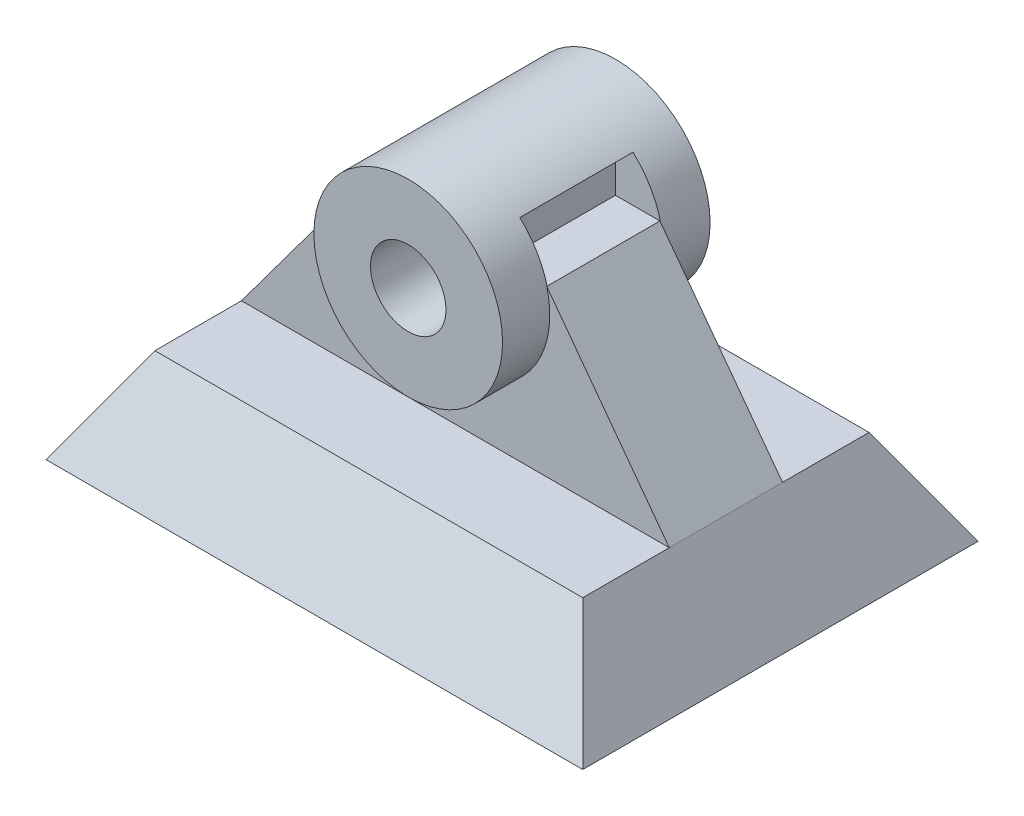
ISO-10303-21;
HEADER;
FILE_DESCRIPTION(('STEP AP214'),'2;1');
FILE_NAME('part.step','',(''),(''),'','','');
FILE_SCHEMA(('AUTOMOTIVE_DESIGN { 1 0 10303 214 1 1 1 1 }'));
ENDSEC;
DATA;
#1=APPLICATION_CONTEXT('core data for automotive mechanical design processes');
#2=APPLICATION_PROTOCOL_DEFINITION('international standard','automotive_design',2000,#1);
#3=PRODUCT_CONTEXT('',#1,'mechanical');
#4=PRODUCT('Part','Part','',(#3));
#5=PRODUCT_RELATED_PRODUCT_CATEGORY('part','',(#4));
#6=PRODUCT_DEFINITION_FORMATION('','',#4);
#7=PRODUCT_DEFINITION_CONTEXT('part definition',#1,'design');
#8=PRODUCT_DEFINITION('design','',#6,#7);
#9=PRODUCT_DEFINITION_SHAPE('','',#8);
#10=(LENGTH_UNIT() NAMED_UNIT(*) SI_UNIT(.MILLI.,.METRE.));
#11=(NAMED_UNIT(*) PLANE_ANGLE_UNIT() SI_UNIT($,.RADIAN.));
#12=(NAMED_UNIT(*) SI_UNIT($,.STERADIAN.) SOLID_ANGLE_UNIT());
#13=UNCERTAINTY_MEASURE_WITH_UNIT(LENGTH_MEASURE(1.E-05),#10,'distance_accuracy_value','');
#14=(GEOMETRIC_REPRESENTATION_CONTEXT(3) GLOBAL_UNCERTAINTY_ASSIGNED_CONTEXT((#13)) GLOBAL_UNIT_ASSIGNED_CONTEXT((#10,
#11,#12)) REPRESENTATION_CONTEXT('',''));
#15=CARTESIAN_POINT('',(0.,0.,0.));
#16=DIRECTION('',(0.,0.,1.));
#17=DIRECTION('',(1.,0.,0.));
#18=AXIS2_PLACEMENT_3D('',#15,#16,#17);
#19=CARTESIAN_POINT('',(-21.295609800344,55.,-18.));
#20=DIRECTION('',(0.,-1.,0.));
#21=DIRECTION('',(0.,0.,-1.));
#22=AXIS2_PLACEMENT_3D('',#19,#20,#21);
#23=PLANE('',#22);
#24=DIRECTION('',(0.,0.,-1.));
#25=VECTOR('',#24,1.);
#26=CARTESIAN_POINT('',(8.,55.,-42.));
#27=LINE('',#26,#25);
#28=CARTESIAN_POINT('',(8.,55.,-18.0806278170545));
#29=VERTEX_POINT('',#28);
#30=CARTESIAN_POINT('',(8.,55.,-42.));
#31=VERTEX_POINT('',#30);
#32=EDGE_CURVE('E320',#29,#31,#27,.T.);
#33=ORIENTED_EDGE('',*,*,#32,.F.);
#34=DIRECTION('',(-1.,0.,0.));
#35=VECTOR('',#34,1.);
#36=CARTESIAN_POINT('',(-21.295609800344,55.,-18.0806278170545));
#37=LINE('',#36,#35);
#38=CARTESIAN_POINT('',(17.4342236617302,55.,-18.0806278170545));
#39=VERTEX_POINT('',#38);
#40=EDGE_CURVE('E45',#39,#29,#37,.T.);
#41=ORIENTED_EDGE('',*,*,#40,.F.);
#42=DIRECTION('',(0.,0.,-1.));
#43=VECTOR('',#42,1.);
#44=CARTESIAN_POINT('',(17.4342236617302,55.,-18.));
#45=LINE('',#44,#43);
#46=CARTESIAN_POINT('',(17.4342236617302,55.,-42.));
#47=VERTEX_POINT('',#46);
#48=EDGE_CURVE('E255',#39,#47,#45,.T.);
#49=ORIENTED_EDGE('',*,*,#48,.T.);
#50=DIRECTION('',(-1.,0.,0.));
#51=VECTOR('',#50,1.);
#52=CARTESIAN_POINT('',(-21.295609800344,55.,-42.));
#53=LINE('',#52,#51);
#54=EDGE_CURVE('E237',#47,#31,#53,.T.);
#55=ORIENTED_EDGE('',*,*,#54,.T.);
#56=EDGE_LOOP('',(#33,#41,#49,#55));
#57=FACE_BOUND('',#56,.T.);
#58=ADVANCED_FACE('F37',(#57),#23,.F.);
#59=CARTESIAN_POINT('',(-22.,38.5972880011593,-18.0806278170545));
#60=DIRECTION('',(0.,0.,1.));
#61=DIRECTION('',(1.,0.,0.));
#62=AXIS2_PLACEMENT_3D('',#59,#60,#61);
#63=PLANE('',#62);
#64=DIRECTION('',(0.,-1.,0.));
#65=VECTOR('',#64,1.);
#66=CARTESIAN_POINT('',(8.,55.,-18.0806278170545));
#67=LINE('',#66,#65);
#68=CARTESIAN_POINT('',(8.,64.691048725986,-18.0806278170545));
#69=VERTEX_POINT('',#68);
#70=EDGE_CURVE('E181',#69,#29,#67,.T.);
#71=ORIENTED_EDGE('',*,*,#70,.F.);
#72=DIRECTION('',(1.,0.,0.));
#73=VECTOR('',#72,1.);
#74=CARTESIAN_POINT('',(-22.,64.691048725986,-18.0806278170545));
#75=LINE('',#74,#73);
#76=CARTESIAN_POINT('',(11.6403454808817,64.691048725986,-18.0806278170545));
#77=VERTEX_POINT('',#76);
#78=EDGE_CURVE('E192',#69,#77,#75,.T.);
#79=ORIENTED_EDGE('',*,*,#78,.T.);
#80=CARTESIAN_POINT('',(-1.93069306930694,50.,-18.0806278170545));
#81=DIRECTION('',(0.,0.,1.));
#82=DIRECTION('',(1.,0.,0.));
#83=AXIS2_PLACEMENT_3D('',#80,#81,#82);
#84=CIRCLE('',#83,20.);
#85=EDGE_CURVE('E188',#39,#77,#84,.T.);
#86=ORIENTED_EDGE('',*,*,#85,.F.);
#87=ORIENTED_EDGE('',*,*,#40,.T.);
#88=EDGE_LOOP('',(#71,#79,#86,#87));
#89=FACE_BOUND('',#88,.T.);
#90=ADVANCED_FACE('F313',(#89),#63,.F.);
#91=CARTESIAN_POINT('',(-22.,64.691048725986,-18.0806278170545));
#92=DIRECTION('',(0.,1.,0.));
#93=DIRECTION('',(0.,0.,1.));
#94=AXIS2_PLACEMENT_3D('',#91,#92,#93);
#95=PLANE('',#94);
#96=DIRECTION('',(0.,0.,1.));
#97=VECTOR('',#96,1.);
#98=CARTESIAN_POINT('',(8.,64.691048725986,-18.0806278170545));
#99=LINE('',#98,#97);
#100=CARTESIAN_POINT('',(8.,64.691048725986,-42.0806278170545));
#101=VERTEX_POINT('',#100);
#102=EDGE_CURVE('E322',#101,#69,#99,.T.);
#103=ORIENTED_EDGE('',*,*,#102,.F.);
#104=DIRECTION('',(1.,0.,0.));
#105=VECTOR('',#104,1.);
#106=CARTESIAN_POINT('',(-22.,64.691048725986,-42.0806278170545));
#107=LINE('',#106,#105);
#108=CARTESIAN_POINT('',(11.6403454808817,64.691048725986,-42.0806278170545));
#109=VERTEX_POINT('',#108);
#110=EDGE_CURVE('E171',#101,#109,#107,.T.);
#111=ORIENTED_EDGE('',*,*,#110,.T.);
#112=DIRECTION('',(0.,0.,-1.));
#113=VECTOR('',#112,1.);
#114=CARTESIAN_POINT('',(11.6403454808817,64.691048725986,-8.));
#115=LINE('',#114,#113);
#116=EDGE_CURVE('E223',#77,#109,#115,.T.);
#117=ORIENTED_EDGE('',*,*,#116,.F.);
#118=ORIENTED_EDGE('',*,*,#78,.F.);
#119=EDGE_LOOP('',(#103,#111,#117,#118));
#120=FACE_BOUND('',#119,.T.);
#121=ADVANCED_FACE('F373',(#120),#95,.F.);
#122=CARTESIAN_POINT('',(-12.,55.,-18.0806278170545));
#123=VERTEX_POINT('',#122);
#124=CARTESIAN_POINT('',(-21.295609800344,55.,-18.0806278170545));
#125=VERTEX_POINT('',#124);
#126=EDGE_CURVE('E305',#123,#125,#37,.T.);
#127=ORIENTED_EDGE('',*,*,#126,.F.);
#128=DIRECTION('',(0.,0.,-1.));
#129=VECTOR('',#128,1.);
#130=CARTESIAN_POINT('',(-12.,55.,-42.));
#131=LINE('',#130,#129);
#132=CARTESIAN_POINT('',(-12.,55.,-42.));
#133=VERTEX_POINT('',#132);
#134=EDGE_CURVE('E52',#123,#133,#131,.T.);
#135=ORIENTED_EDGE('',*,*,#134,.T.);
#136=CARTESIAN_POINT('',(-21.295609800344,55.,-42.));
#137=VERTEX_POINT('',#136);
#138=EDGE_CURVE('E250',#133,#137,#53,.T.);
#139=ORIENTED_EDGE('',*,*,#138,.T.);
#140=DIRECTION('',(0.,0.,-1.));
#141=VECTOR('',#140,1.);
#142=CARTESIAN_POINT('',(-21.295609800344,55.,-18.));
#143=LINE('',#142,#141);
#144=EDGE_CURVE('E242',#125,#137,#143,.T.);
#145=ORIENTED_EDGE('',*,*,#144,.F.);
#146=EDGE_LOOP('',(#127,#135,#139,#145));
#147=FACE_BOUND('',#146,.T.);
#148=ADVANCED_FACE('F365',(#147),#23,.F.);
#149=CARTESIAN_POINT('',(0.,0.,-18.));
#150=DIRECTION('',(0.,0.,-1.));
#151=DIRECTION('',(-1.,0.,0.));
#152=AXIS2_PLACEMENT_3D('',#149,#150,#151);
#153=PLANE('',#152);
#154=CARTESIAN_POINT('',(-1.93069306930694,50.,-18.));
#155=DIRECTION('',(0.,0.,-1.));
#156=DIRECTION('',(-1.,0.,0.));
#157=AXIS2_PLACEMENT_3D('',#154,#155,#156);
#158=CIRCLE('',#157,20.);
#159=CARTESIAN_POINT('',(-21.295609800344,55.,-18.));
#160=VERTEX_POINT('',#159);
#161=CARTESIAN_POINT('',(17.4342236617302,55.,-18.));
#162=VERTEX_POINT('',#161);
#163=EDGE_CURVE('E229',#160,#162,#158,.F.);
#164=ORIENTED_EDGE('',*,*,#163,.F.);
#165=DIRECTION('',(-0.596090179592801,-0.802917491273557,0.));
#166=VECTOR('',#165,1.);
#167=CARTESIAN_POINT('',(-47.2797943678713,20.,-18.));
#168=LINE('',#167,#166);
#169=CARTESIAN_POINT('',(-47.2797943678713,20.,-18.));
#170=VERTEX_POINT('',#169);
#171=EDGE_CURVE('E233',#160,#170,#168,.T.);
#172=ORIENTED_EDGE('',*,*,#171,.T.);
#173=DIRECTION('',(1.,0.,0.));
#174=VECTOR('',#173,1.);
#175=CARTESIAN_POINT('',(43.4184082292574,20.,-18.));
#176=LINE('',#175,#174);
#177=CARTESIAN_POINT('',(43.4184082292574,20.,-18.));
#178=VERTEX_POINT('',#177);
#179=EDGE_CURVE('E236',#170,#178,#176,.T.);
#180=ORIENTED_EDGE('',*,*,#179,.T.);
#181=DIRECTION('',(-0.596090179592801,0.802917491273557,0.));
#182=VECTOR('',#181,1.);
#183=CARTESIAN_POINT('',(17.4342236617302,55.,-18.));
#184=LINE('',#183,#182);
#185=EDGE_CURVE('E240',#178,#162,#184,.T.);
#186=ORIENTED_EDGE('',*,*,#185,.T.);
#187=EDGE_LOOP('',(#164,#172,#180,#186));
#188=FACE_BOUND('',#187,.T.);
#189=ADVANCED_FACE('F355',(#188),#153,.F.);
#190=CARTESIAN_POINT('',(0.,0.,-42.));
#191=DIRECTION('',(0.,0.,-1.));
#192=DIRECTION('',(-1.,0.,0.));
#193=AXIS2_PLACEMENT_3D('',#190,#191,#192);
#194=PLANE('',#193);
#195=CARTESIAN_POINT('',(-1.93069306930694,50.,-42.));
#196=DIRECTION('',(0.,0.,-1.));
#197=DIRECTION('',(-1.,0.,0.));
#198=AXIS2_PLACEMENT_3D('',#195,#196,#197);
#199=CIRCLE('',#198,8.);
#200=CARTESIAN_POINT('',(4.31430492909144,55.,-42.));
#201=VERTEX_POINT('',#200);
#202=CARTESIAN_POINT('',(-8.17569106770532,55.,-42.));
#203=VERTEX_POINT('',#202);
#204=EDGE_CURVE('E164',#201,#203,#199,.T.);
#205=ORIENTED_EDGE('',*,*,#204,.F.);
#206=DIRECTION('',(-1.,0.,0.));
#207=VECTOR('',#206,1.);
#208=CARTESIAN_POINT('',(8.,55.,-42.));
#209=LINE('',#208,#207);
#210=EDGE_CURVE('E60',#31,#201,#209,.T.);
#211=ORIENTED_EDGE('',*,*,#210,.F.);
#212=ORIENTED_EDGE('',*,*,#54,.F.);
#213=DIRECTION('',(-0.596090179592801,0.802917491273557,0.));
#214=VECTOR('',#213,1.);
#215=CARTESIAN_POINT('',(17.4342236617302,55.,-42.));
#216=LINE('',#215,#214);
#217=CARTESIAN_POINT('',(43.4184082292574,20.,-42.));
#218=VERTEX_POINT('',#217);
#219=EDGE_CURVE('E247',#218,#47,#216,.T.);
#220=ORIENTED_EDGE('',*,*,#219,.F.);
#221=DIRECTION('',(1.,0.,0.));
#222=VECTOR('',#221,1.);
#223=CARTESIAN_POINT('',(43.4184082292574,20.,-42.));
#224=LINE('',#223,#222);
#225=CARTESIAN_POINT('',(-47.2797943678713,20.,-42.));
#226=VERTEX_POINT('',#225);
#227=EDGE_CURVE('E245',#226,#218,#224,.T.);
#228=ORIENTED_EDGE('',*,*,#227,.F.);
#229=DIRECTION('',(-0.596090179592801,-0.802917491273557,0.));
#230=VECTOR('',#229,1.);
#231=CARTESIAN_POINT('',(-47.2797943678713,20.,-42.));
#232=LINE('',#231,#230);
#233=EDGE_CURVE('E232',#137,#226,#232,.T.);
#234=ORIENTED_EDGE('',*,*,#233,.F.);
#235=ORIENTED_EDGE('',*,*,#138,.F.);
#236=EDGE_CURVE('E170',#203,#133,#53,.T.);
#237=ORIENTED_EDGE('',*,*,#236,.F.);
#238=EDGE_LOOP('',(#205,#211,#212,#220,#228,#234,#235,#237));
#239=FACE_BOUND('',#238,.T.);
#240=DIRECTION('',(-1.,0.,0.));
#241=VECTOR('',#240,1.);
#242=CARTESIAN_POINT('',(0.,38.5972880011593,-42.));
#243=LINE('',#242,#241);
#244=CARTESIAN_POINT('',(14.5003190441173,38.5972880011592,-42.));
#245=VERTEX_POINT('',#244);
#246=CARTESIAN_POINT('',(-18.3617051827312,38.5972880011593,-42.));
#247=VERTEX_POINT('',#246);
#248=EDGE_CURVE('E300',#245,#247,#243,.T.);
#249=ORIENTED_EDGE('',*,*,#248,.T.);
#250=CARTESIAN_POINT('',(-1.93069306930694,50.,-42.));
#251=DIRECTION('',(0.,0.,-1.));
#252=DIRECTION('',(-1.,0.,0.));
#253=AXIS2_PLACEMENT_3D('',#250,#251,#252);
#254=CIRCLE('',#253,20.);
#255=EDGE_CURVE('E303',#247,#245,#254,.F.);
#256=ORIENTED_EDGE('',*,*,#255,.T.);
#257=EDGE_LOOP('',(#249,#256));
#258=FACE_BOUND('',#257,.T.);
#259=ADVANCED_FACE('F168',(#239,#258),#194,.T.);
#260=CARTESIAN_POINT('',(-46.9306930693069,20.,-60.));
#261=DIRECTION('',(0.,1.,0.));
#262=DIRECTION('',(0.,0.,1.));
#263=AXIS2_PLACEMENT_3D('',#260,#261,#262);
#264=PLANE('',#263);
#265=DIRECTION('',(0.,0.,1.));
#266=VECTOR('',#265,1.);
#267=CARTESIAN_POINT('',(-47.2797943678713,20.,-60.));
#268=LINE('',#267,#266);
#269=CARTESIAN_POINT('',(-47.2797943678713,20.,-60.3491012985643));
#270=VERTEX_POINT('',#269);
#271=EDGE_CURVE('E265',#270,#226,#268,.T.);
#272=ORIENTED_EDGE('',*,*,#271,.T.);
#273=ORIENTED_EDGE('',*,*,#227,.T.);
#274=DIRECTION('',(0.,0.,1.));
#275=VECTOR('',#274,1.);
#276=CARTESIAN_POINT('',(43.4184082292574,20.,-60.));
#277=LINE('',#276,#275);
#278=CARTESIAN_POINT('',(43.4184082292574,20.,-60.3491012985643));
#279=VERTEX_POINT('',#278);
#280=EDGE_CURVE('E275',#279,#218,#277,.T.);
#281=ORIENTED_EDGE('',*,*,#280,.F.);
#282=DIRECTION('',(-1.,0.,0.));
#283=VECTOR('',#282,1.);
#284=CARTESIAN_POINT('',(-46.9306930693069,20.,-60.3491012985643));
#285=LINE('',#284,#283);
#286=EDGE_CURVE('E279',#279,#270,#285,.T.);
#287=ORIENTED_EDGE('',*,*,#286,.T.);
#288=EDGE_LOOP('',(#272,#273,#281,#287));
#289=FACE_BOUND('',#288,.T.);
#290=ADVANCED_FACE('F354',(#289),#264,.T.);
#291=CARTESIAN_POINT('',(43.0693069306931,0.,-60.));
#292=DIRECTION('',(0.,-1.,0.));
#293=DIRECTION('',(0.,0.,-1.));
#294=AXIS2_PLACEMENT_3D('',#291,#292,#293);
#295=PLANE('',#294);
#296=DIRECTION('',(-1.,0.,0.));
#297=VECTOR('',#296,1.);
#298=CARTESIAN_POINT('',(43.0693069306931,0.,11.8961066823569));
#299=LINE('',#298,#297);
#300=CARTESIAN_POINT('',(-58.8267997516638,0.,11.8961066823569));
#301=VERTEX_POINT('',#300);
#302=CARTESIAN_POINT('',(54.96541361305,0.,11.8961066823569));
#303=VERTEX_POINT('',#302);
#304=EDGE_CURVE('E264',#301,#303,#299,.F.);
#305=ORIENTED_EDGE('',*,*,#304,.F.);
#306=DIRECTION('',(0.,0.,1.));
#307=VECTOR('',#306,1.);
#308=CARTESIAN_POINT('',(-58.8267997516638,0.,-60.));
#309=LINE('',#308,#307);
#310=CARTESIAN_POINT('',(-58.8267997516638,0.,-71.8961066823569));
#311=VERTEX_POINT('',#310);
#312=EDGE_CURVE('E268',#311,#301,#309,.T.);
#313=ORIENTED_EDGE('',*,*,#312,.F.);
#314=DIRECTION('',(1.,0.,0.));
#315=VECTOR('',#314,1.);
#316=CARTESIAN_POINT('',(43.0693069306931,0.,-71.8961066823569));
#317=LINE('',#316,#315);
#318=CARTESIAN_POINT('',(54.96541361305,0.,-71.8961066823569));
#319=VERTEX_POINT('',#318);
#320=EDGE_CURVE('E289',#311,#319,#317,.T.);
#321=ORIENTED_EDGE('',*,*,#320,.T.);
#322=DIRECTION('',(0.,0.,1.));
#323=VECTOR('',#322,1.);
#324=CARTESIAN_POINT('',(54.96541361305,0.,-60.));
#325=LINE('',#324,#323);
#326=EDGE_CURVE('E286',#319,#303,#325,.T.);
#327=ORIENTED_EDGE('',*,*,#326,.T.);
#328=EDGE_LOOP('',(#305,#313,#321,#327));
#329=FACE_BOUND('',#328,.T.);
#330=ADVANCED_FACE('F361',(#329),#295,.T.);
#331=CARTESIAN_POINT('',(-47.2797943678713,20.,-60.));
#332=DIRECTION('',(-0.866025403784438,0.500000000000001,0.));
#333=DIRECTION('',(-0.500000000000001,-0.866025403784438,0.));
#334=AXIS2_PLACEMENT_3D('',#331,#332,#333);
#335=PLANE('',#334);
#336=DIRECTION('',(0.447213595499959,0.774596669241482,-0.447213595499959));
#337=VECTOR('',#336,1.);
#338=CARTESIAN_POINT('',(-35.2099741081584,40.9055419280469,-11.7207189611486));
#339=LINE('',#338,#337);
#340=CARTESIAN_POINT('',(-47.2797943678713,20.,0.349101298564352));
#341=VERTEX_POINT('',#340);
#342=EDGE_CURVE('E273',#341,#301,#339,.F.);
#343=ORIENTED_EDGE('',*,*,#342,.F.);
#344=EDGE_CURVE('E269',#170,#341,#268,.T.);
#345=ORIENTED_EDGE('',*,*,#344,.F.);
#346=DIRECTION('',(0.,0.,-1.));
#347=VECTOR('',#346,1.);
#348=CARTESIAN_POINT('',(-47.2797943678713,20.,-18.));
#349=LINE('',#348,#347);
#350=EDGE_CURVE('E262',#170,#226,#349,.T.);
#351=ORIENTED_EDGE('',*,*,#350,.T.);
#352=ORIENTED_EDGE('',*,*,#271,.F.);
#353=DIRECTION('',(-0.447213595499959,-0.774596669241482,-0.447213595499959));
#354=VECTOR('',#353,1.);
#355=CARTESIAN_POINT('',(-47.2099741081584,20.1209322372203,-60.2792810388515));
#356=LINE('',#355,#354);
#357=EDGE_CURVE('E282',#270,#311,#356,.T.);
#358=ORIENTED_EDGE('',*,*,#357,.T.);
#359=ORIENTED_EDGE('',*,*,#312,.T.);
#360=EDGE_LOOP('',(#343,#345,#351,#352,#358,#359));
#361=FACE_BOUND('',#360,.T.);
#362=ADVANCED_FACE('F528',(#361),#335,.T.);
#363=ORIENTED_EDGE('',*,*,#179,.F.);
#364=ORIENTED_EDGE('',*,*,#344,.T.);
#365=DIRECTION('',(1.,0.,0.));
#366=VECTOR('',#365,1.);
#367=CARTESIAN_POINT('',(-46.9306930693069,20.,0.349101298564351));
#368=LINE('',#367,#366);
#369=CARTESIAN_POINT('',(43.4184082292574,20.,0.349101298564352));
#370=VERTEX_POINT('',#369);
#371=EDGE_CURVE('E270',#370,#341,#368,.F.);
#372=ORIENTED_EDGE('',*,*,#371,.F.);
#373=EDGE_CURVE('E278',#178,#370,#277,.T.);
#374=ORIENTED_EDGE('',*,*,#373,.F.);
#375=EDGE_LOOP('',(#363,#364,#372,#374));
#376=FACE_BOUND('',#375,.T.);
#377=ADVANCED_FACE('F364',(#376),#264,.T.);
#378=CARTESIAN_POINT('',(43.4184082292574,20.,-60.));
#379=DIRECTION('',(0.866025403784438,0.500000000000001,0.));
#380=DIRECTION('',(-0.500000000000001,0.866025403784438,0.));
#381=AXIS2_PLACEMENT_3D('',#378,#379,#380);
#382=PLANE('',#381);
#383=DIRECTION('',(0.447213595499959,-0.774596669241482,0.447213595499959));
#384=VECTOR('',#383,1.);
#385=CARTESIAN_POINT('',(31.3485879695445,40.9055419280469,-11.7207189611486));
#386=LINE('',#385,#384);
#387=EDGE_CURVE('E274',#303,#370,#386,.F.);
#388=ORIENTED_EDGE('',*,*,#387,.F.);
#389=ORIENTED_EDGE('',*,*,#326,.F.);
#390=DIRECTION('',(-0.447213595499959,0.774596669241482,0.447213595499959));
#391=VECTOR('',#390,1.);
#392=CARTESIAN_POINT('',(43.3485879695445,20.1209322372203,-60.2792810388515));
#393=LINE('',#392,#391);
#394=EDGE_CURVE('E283',#319,#279,#393,.T.);
#395=ORIENTED_EDGE('',*,*,#394,.T.);
#396=ORIENTED_EDGE('',*,*,#280,.T.);
#397=DIRECTION('',(0.,0.,-1.));
#398=VECTOR('',#397,1.);
#399=CARTESIAN_POINT('',(43.4184082292574,20.,-18.));
#400=LINE('',#399,#398);
#401=EDGE_CURVE('E259',#178,#218,#400,.T.);
#402=ORIENTED_EDGE('',*,*,#401,.F.);
#403=ORIENTED_EDGE('',*,*,#373,.T.);
#404=EDGE_LOOP('',(#388,#389,#395,#396,#402,#403));
#405=FACE_BOUND('',#404,.T.);
#406=ADVANCED_FACE('F513',(#405),#382,.T.);
#407=CARTESIAN_POINT('',(-46.9306930693069,20.,-60.3491012985643));
#408=DIRECTION('',(0.,0.500000000000001,-0.866025403784438));
#409=DIRECTION('',(0.,0.866025403784438,0.500000000000001));
#410=AXIS2_PLACEMENT_3D('',#407,#408,#409);
#411=PLANE('',#410);
#412=ORIENTED_EDGE('',*,*,#320,.F.);
#413=ORIENTED_EDGE('',*,*,#357,.F.);
#414=ORIENTED_EDGE('',*,*,#286,.F.);
#415=ORIENTED_EDGE('',*,*,#394,.F.);
#416=EDGE_LOOP('',(#412,#413,#414,#415));
#417=FACE_BOUND('',#416,.T.);
#418=ADVANCED_FACE('F505',(#417),#411,.T.);
#419=CARTESIAN_POINT('',(-46.9306930693069,20.,0.349101298564351));
#420=DIRECTION('',(0.,0.500000000000001,0.866025403784438));
#421=DIRECTION('',(0.,-0.866025403784438,0.500000000000001));
#422=AXIS2_PLACEMENT_3D('',#419,#420,#421);
#423=PLANE('',#422);
#424=ORIENTED_EDGE('',*,*,#304,.T.);
#425=ORIENTED_EDGE('',*,*,#387,.T.);
#426=ORIENTED_EDGE('',*,*,#371,.T.);
#427=ORIENTED_EDGE('',*,*,#342,.T.);
#428=EDGE_LOOP('',(#424,#425,#426,#427));
#429=FACE_BOUND('',#428,.T.);
#430=ADVANCED_FACE('F39',(#429),#423,.T.);
#431=CARTESIAN_POINT('',(-47.2797943678713,20.,-18.));
#432=DIRECTION('',(0.802917491273557,-0.596090179592801,0.));
#433=DIRECTION('',(0.596090179592801,0.802917491273557,0.));
#434=AXIS2_PLACEMENT_3D('',#431,#432,#433);
#435=PLANE('',#434);
#436=ORIENTED_EDGE('',*,*,#233,.T.);
#437=ORIENTED_EDGE('',*,*,#350,.F.);
#438=ORIENTED_EDGE('',*,*,#171,.F.);
#439=EDGE_CURVE('E252',#160,#125,#143,.T.);
#440=ORIENTED_EDGE('',*,*,#439,.T.);
#441=ORIENTED_EDGE('',*,*,#144,.T.);
#442=EDGE_LOOP('',(#436,#437,#438,#440,#441));
#443=FACE_BOUND('',#442,.T.);
#444=ADVANCED_FACE('F491',(#443),#435,.F.);
#445=CARTESIAN_POINT('',(17.4342236617302,55.,-18.));
#446=DIRECTION('',(-0.802917491273557,-0.596090179592801,0.));
#447=DIRECTION('',(0.596090179592801,-0.802917491273557,0.));
#448=AXIS2_PLACEMENT_3D('',#445,#446,#447);
#449=PLANE('',#448);
#450=ORIENTED_EDGE('',*,*,#219,.T.);
#451=ORIENTED_EDGE('',*,*,#48,.F.);
#452=EDGE_CURVE('E256',#162,#39,#45,.T.);
#453=ORIENTED_EDGE('',*,*,#452,.F.);
#454=ORIENTED_EDGE('',*,*,#185,.F.);
#455=ORIENTED_EDGE('',*,*,#401,.T.);
#456=EDGE_LOOP('',(#450,#451,#453,#454,#455));
#457=FACE_BOUND('',#456,.T.);
#458=ADVANCED_FACE('F398',(#457),#449,.F.);
#459=CARTESIAN_POINT('',(-15.5017316194956,64.691048725986,-18.0806278170545));
#460=VERTEX_POINT('',#459);
#461=CARTESIAN_POINT('',(-12.,64.691048725986,-18.0806278170545));
#462=VERTEX_POINT('',#461);
#463=EDGE_CURVE('E189',#460,#462,#75,.T.);
#464=ORIENTED_EDGE('',*,*,#463,.T.);
#465=DIRECTION('',(0.,-1.,0.));
#466=VECTOR('',#465,1.);
#467=CARTESIAN_POINT('',(-12.,55.,-18.0806278170545));
#468=LINE('',#467,#466);
#469=EDGE_CURVE('E332',#462,#123,#468,.T.);
#470=ORIENTED_EDGE('',*,*,#469,.T.);
#471=ORIENTED_EDGE('',*,*,#126,.T.);
#472=EDGE_CURVE('E198',#460,#125,#84,.T.);
#473=ORIENTED_EDGE('',*,*,#472,.F.);
#474=EDGE_LOOP('',(#464,#470,#471,#473));
#475=FACE_BOUND('',#474,.T.);
#476=ADVANCED_FACE('F375',(#475),#63,.F.);
#477=CARTESIAN_POINT('',(-1.93069306930694,50.,-52.));
#478=DIRECTION('',(0.,0.,1.));
#479=DIRECTION('',(1.,0.,0.));
#480=AXIS2_PLACEMENT_3D('',#477,#478,#479);
#481=CYLINDRICAL_SURFACE('',#480,8.);
#482=CARTESIAN_POINT('',(-1.93069306930694,50.,-8.));
#483=DIRECTION('',(0.,0.,1.));
#484=DIRECTION('',(1.,0.,0.));
#485=AXIS2_PLACEMENT_3D('',#482,#483,#484);
#486=CIRCLE('',#485,8.);
#487=CARTESIAN_POINT('',(6.06930693069306,50.,-8.));
#488=VERTEX_POINT('',#487);
#489=EDGE_CURVE('E208',#488,#488,#486,.T.);
#490=ORIENTED_EDGE('',*,*,#489,.T.);
#491=EDGE_LOOP('',(#490));
#492=FACE_BOUND('',#491,.T.);
#493=ORIENTED_EDGE('',*,*,#204,.T.);
#494=CARTESIAN_POINT('',(-1.93069306930694,50.,-41.9584008814039));
#495=DIRECTION('',(0.,0.00831953578727745,0.999965392063287));
#496=DIRECTION('',(0.,-0.999965392063287,0.00831953578727745));
#497=AXIS2_PLACEMENT_3D('',#494,#495,#496);
#498=ELLIPSE('',#497,8.00027687307571,8.);
#499=EDGE_CURVE('E11',#201,#203,#498,.T.);
#500=ORIENTED_EDGE('',*,*,#499,.F.);
#501=EDGE_LOOP('',(#493,#500));
#502=FACE_BOUND('',#501,.T.);
#503=ADVANCED_FACE('F163',(#492,#502),#481,.F.);
#504=CARTESIAN_POINT('',(-1.93069306930694,50.,-8.));
#505=DIRECTION('',(0.,0.,-1.));
#506=DIRECTION('',(-1.,0.,0.));
#507=AXIS2_PLACEMENT_3D('',#504,#505,#506);
#508=CYLINDRICAL_SURFACE('',#507,20.);
#509=CARTESIAN_POINT('',(-1.93069306930694,50.,-8.));
#510=DIRECTION('',(0.,0.,1.));
#511=DIRECTION('',(1.,0.,0.));
#512=AXIS2_PLACEMENT_3D('',#509,#510,#511);
#513=CIRCLE('',#512,20.);
#514=CARTESIAN_POINT('',(18.0693069306931,50.,-8.));
#515=VERTEX_POINT('',#514);
#516=EDGE_CURVE('E211',#515,#515,#513,.T.);
#517=ORIENTED_EDGE('',*,*,#516,.F.);
#518=EDGE_LOOP('',(#517));
#519=FACE_BOUND('',#518,.T.);
#520=CARTESIAN_POINT('',(-1.93069306930694,50.,-52.));
#521=DIRECTION('',(0.,0.,1.));
#522=DIRECTION('',(1.,0.,0.));
#523=AXIS2_PLACEMENT_3D('',#520,#521,#522);
#524=CIRCLE('',#523,20.);
#525=CARTESIAN_POINT('',(18.0693069306931,50.,-52.));
#526=VERTEX_POINT('',#525);
#527=EDGE_CURVE('E207',#526,#526,#524,.T.);
#528=ORIENTED_EDGE('',*,*,#527,.T.);
#529=EDGE_LOOP('',(#528));
#530=FACE_BOUND('',#529,.T.);
#531=ORIENTED_EDGE('',*,*,#472,.T.);
#532=ORIENTED_EDGE('',*,*,#439,.F.);
#533=ORIENTED_EDGE('',*,*,#163,.T.);
#534=ORIENTED_EDGE('',*,*,#452,.T.);
#535=ORIENTED_EDGE('',*,*,#85,.T.);
#536=ORIENTED_EDGE('',*,*,#116,.T.);
#537=CARTESIAN_POINT('',(-1.93069306930694,50.,-42.0806278170545));
#538=DIRECTION('',(0.,0.,-1.));
#539=DIRECTION('',(-1.,0.,0.));
#540=AXIS2_PLACEMENT_3D('',#537,#538,#539);
#541=CIRCLE('',#540,20.);
#542=CARTESIAN_POINT('',(14.5003190441173,38.5972880011593,-42.0806278170545));
#543=VERTEX_POINT('',#542);
#544=EDGE_CURVE('E202',#109,#543,#541,.T.);
#545=ORIENTED_EDGE('',*,*,#544,.T.);
#546=DIRECTION('',(0.,0.,-1.));
#547=VECTOR('',#546,1.);
#548=CARTESIAN_POINT('',(14.5003190441173,38.5972880011592,-8.));
#549=LINE('',#548,#547);
#550=EDGE_CURVE('E226',#543,#245,#549,.F.);
#551=ORIENTED_EDGE('',*,*,#550,.T.);
#552=ORIENTED_EDGE('',*,*,#255,.F.);
#553=DIRECTION('',(0.,0.,-1.));
#554=VECTOR('',#553,1.);
#555=CARTESIAN_POINT('',(-18.3617051827312,38.5972880011592,-8.));
#556=LINE('',#555,#554);
#557=CARTESIAN_POINT('',(-18.3617051827312,38.5972880011593,-42.0806278170545));
#558=VERTEX_POINT('',#557);
#559=EDGE_CURVE('E221',#247,#558,#556,.T.);
#560=ORIENTED_EDGE('',*,*,#559,.T.);
#561=CARTESIAN_POINT('',(-15.5017316194956,64.691048725986,-42.0806278170545));
#562=VERTEX_POINT('',#561);
#563=EDGE_CURVE('E199',#558,#562,#541,.T.);
#564=ORIENTED_EDGE('',*,*,#563,.T.);
#565=DIRECTION('',(0.,0.,-1.));
#566=VECTOR('',#565,1.);
#567=CARTESIAN_POINT('',(-15.5017316194956,64.691048725986,-8.));
#568=LINE('',#567,#566);
#569=EDGE_CURVE('E214',#562,#460,#568,.F.);
#570=ORIENTED_EDGE('',*,*,#569,.T.);
#571=EDGE_LOOP('',(#531,#532,#533,#534,#535,#536,#545,#551,#552,#560,#564,#570));
#572=FACE_BOUND('',#571,.T.);
#573=ADVANCED_FACE('F346',(#519,#530,#572),#508,.T.);
#574=CARTESIAN_POINT('',(-1.93069306930694,50.,-52.));
#575=DIRECTION('',(0.,0.,1.));
#576=DIRECTION('',(1.,0.,0.));
#577=AXIS2_PLACEMENT_3D('',#574,#575,#576);
#578=CIRCLE('',#577,8.);
#579=CARTESIAN_POINT('',(6.06930693069306,50.,-52.));
#580=VERTEX_POINT('',#579);
#581=EDGE_CURVE('E204',#580,#580,#578,.T.);
#582=ORIENTED_EDGE('',*,*,#581,.F.);
#583=EDGE_LOOP('',(#582));
#584=FACE_BOUND('',#583,.T.);
#585=CARTESIAN_POINT('',(-1.93069306930694,50.,-42.0806278170545));
#586=DIRECTION('',(0.,0.,-1.));
#587=DIRECTION('',(-1.,0.,0.));
#588=AXIS2_PLACEMENT_3D('',#585,#586,#587);
#589=CIRCLE('',#588,8.);
#590=CARTESIAN_POINT('',(-9.93069306930694,50.,-42.0806278170545));
#591=VERTEX_POINT('',#590);
#592=EDGE_CURVE('E203',#591,#591,#589,.F.);
#593=ORIENTED_EDGE('',*,*,#592,.T.);
#594=EDGE_LOOP('',(#593));
#595=FACE_BOUND('',#594,.T.);
#596=ADVANCED_FACE('F407',(#584,#595),#481,.F.);
#597=CARTESIAN_POINT('',(-1.93069306930694,50.,-8.));
#598=DIRECTION('',(0.,0.,1.));
#599=DIRECTION('',(1.,0.,0.));
#600=AXIS2_PLACEMENT_3D('',#597,#598,#599);
#601=PLANE('',#600);
#602=ORIENTED_EDGE('',*,*,#489,.F.);
#603=EDGE_LOOP('',(#602));
#604=FACE_BOUND('',#603,.T.);
#605=ORIENTED_EDGE('',*,*,#516,.T.);
#606=EDGE_LOOP('',(#605));
#607=FACE_BOUND('',#606,.T.);
#608=ADVANCED_FACE('F408',(#604,#607),#601,.T.);
#609=CARTESIAN_POINT('',(-1.93069306930694,50.,-52.));
#610=DIRECTION('',(0.,0.,1.));
#611=DIRECTION('',(1.,0.,0.));
#612=AXIS2_PLACEMENT_3D('',#609,#610,#611);
#613=PLANE('',#612);
#614=ORIENTED_EDGE('',*,*,#581,.T.);
#615=EDGE_LOOP('',(#614));
#616=FACE_BOUND('',#615,.T.);
#617=ORIENTED_EDGE('',*,*,#527,.F.);
#618=EDGE_LOOP('',(#617));
#619=FACE_BOUND('',#618,.T.);
#620=ADVANCED_FACE('F396',(#616,#619),#613,.F.);
#621=CARTESIAN_POINT('',(-22.,38.5972880011593,-42.0806278170545));
#622=DIRECTION('',(0.,-1.,0.));
#623=DIRECTION('',(0.,0.,-1.));
#624=AXIS2_PLACEMENT_3D('',#621,#622,#623);
#625=PLANE('',#624);
#626=ORIENTED_EDGE('',*,*,#248,.F.);
#627=ORIENTED_EDGE('',*,*,#550,.F.);
#628=DIRECTION('',(1.,0.,0.));
#629=VECTOR('',#628,1.);
#630=CARTESIAN_POINT('',(-22.,38.5972880011593,-42.0806278170545));
#631=LINE('',#630,#629);
#632=EDGE_CURVE('E185',#558,#543,#631,.T.);
#633=ORIENTED_EDGE('',*,*,#632,.F.);
#634=ORIENTED_EDGE('',*,*,#559,.F.);
#635=EDGE_LOOP('',(#626,#627,#633,#634));
#636=FACE_BOUND('',#635,.T.);
#637=ADVANCED_FACE('F352',(#636),#625,.F.);
#638=CARTESIAN_POINT('',(-12.,64.691048725986,-42.0806278170545));
#639=VERTEX_POINT('',#638);
#640=EDGE_CURVE('E193',#562,#639,#107,.T.);
#641=ORIENTED_EDGE('',*,*,#640,.T.);
#642=DIRECTION('',(0.,0.,1.));
#643=VECTOR('',#642,1.);
#644=CARTESIAN_POINT('',(-12.,64.691048725986,-18.0806278170545));
#645=LINE('',#644,#643);
#646=EDGE_CURVE('E331',#639,#462,#645,.T.);
#647=ORIENTED_EDGE('',*,*,#646,.T.);
#648=ORIENTED_EDGE('',*,*,#463,.F.);
#649=ORIENTED_EDGE('',*,*,#569,.F.);
#650=EDGE_LOOP('',(#641,#647,#648,#649));
#651=FACE_BOUND('',#650,.T.);
#652=ADVANCED_FACE('F343',(#651),#95,.F.);
#653=CARTESIAN_POINT('',(-22.,64.691048725986,-42.0806278170545));
#654=DIRECTION('',(0.,0.,-1.));
#655=DIRECTION('',(-1.,0.,0.));
#656=AXIS2_PLACEMENT_3D('',#653,#654,#655);
#657=PLANE('',#656);
#658=ORIENTED_EDGE('',*,*,#592,.F.);
#659=EDGE_LOOP('',(#658));
#660=FACE_BOUND('',#659,.T.);
#661=ORIENTED_EDGE('',*,*,#640,.F.);
#662=ORIENTED_EDGE('',*,*,#563,.F.);
#663=ORIENTED_EDGE('',*,*,#632,.T.);
#664=ORIENTED_EDGE('',*,*,#544,.F.);
#665=ORIENTED_EDGE('',*,*,#110,.F.);
#666=DIRECTION('',(-1.,0.,0.));
#667=VECTOR('',#666,1.);
#668=CARTESIAN_POINT('',(8.,64.691048725986,-42.0806278170545));
#669=LINE('',#668,#667);
#670=EDGE_CURVE('E179',#101,#639,#669,.T.);
#671=ORIENTED_EDGE('',*,*,#670,.T.);
#672=EDGE_LOOP('',(#661,#662,#663,#664,#665,#671));
#673=FACE_BOUND('',#672,.T.);
#674=ADVANCED_FACE('F339',(#660,#673),#657,.F.);
#675=CARTESIAN_POINT('',(8.,64.691048725986,-42.0806278170545));
#676=DIRECTION('',(0.,0.00831953578727745,0.999965392063287));
#677=DIRECTION('',(0.,-0.999965392063287,0.00831953578727745));
#678=AXIS2_PLACEMENT_3D('',#675,#676,#677);
#679=PLANE('',#678);
#680=ORIENTED_EDGE('',*,*,#210,.T.);
#681=ORIENTED_EDGE('',*,*,#499,.T.);
#682=ORIENTED_EDGE('',*,*,#236,.T.);
#683=DIRECTION('',(0.,0.999965392063288,-0.00831953578727745));
#684=VECTOR('',#683,1.);
#685=CARTESIAN_POINT('',(-12.,64.691048725986,-42.0806278170545));
#686=LINE('',#685,#684);
#687=EDGE_CURVE('E328',#133,#639,#686,.T.);
#688=ORIENTED_EDGE('',*,*,#687,.T.);
#689=ORIENTED_EDGE('',*,*,#670,.F.);
#690=DIRECTION('',(0.,0.999965392063288,-0.00831953578727745));
#691=VECTOR('',#690,1.);
#692=CARTESIAN_POINT('',(8.,64.691048725986,-42.0806278170545));
#693=LINE('',#692,#691);
#694=EDGE_CURVE('E177',#31,#101,#693,.T.);
#695=ORIENTED_EDGE('',*,*,#694,.F.);
#696=EDGE_LOOP('',(#680,#681,#682,#688,#689,#695));
#697=FACE_BOUND('',#696,.T.);
#698=ADVANCED_FACE('F174',(#697),#679,.F.);
#699=CARTESIAN_POINT('',(8.,0.,0.));
#700=DIRECTION('',(-1.,0.,0.));
#701=DIRECTION('',(0.,0.,1.));
#702=AXIS2_PLACEMENT_3D('',#699,#700,#701);
#703=PLANE('',#702);
#704=ORIENTED_EDGE('',*,*,#32,.T.);
#705=ORIENTED_EDGE('',*,*,#694,.T.);
#706=ORIENTED_EDGE('',*,*,#102,.T.);
#707=ORIENTED_EDGE('',*,*,#70,.T.);
#708=EDGE_LOOP('',(#704,#705,#706,#707));
#709=FACE_BOUND('',#708,.T.);
#710=ADVANCED_FACE('F319',(#709),#703,.F.);
#711=CARTESIAN_POINT('',(-12.,0.,0.));
#712=DIRECTION('',(-1.,0.,0.));
#713=DIRECTION('',(0.,0.,1.));
#714=AXIS2_PLACEMENT_3D('',#711,#712,#713);
#715=PLANE('',#714);
#716=ORIENTED_EDGE('',*,*,#134,.F.);
#717=ORIENTED_EDGE('',*,*,#469,.F.);
#718=ORIENTED_EDGE('',*,*,#646,.F.);
#719=ORIENTED_EDGE('',*,*,#687,.F.);
#720=EDGE_LOOP('',(#716,#717,#718,#719));
#721=FACE_BOUND('',#720,.T.);
#722=ADVANCED_FACE('F385',(#721),#715,.T.);
#723=CLOSED_SHELL('',(#58,#90,#121,#148,#189,#259,#290,#330,#362,#377,#406,#418,#430,#444,#458,
#476,#503,#573,#596,#608,#620,#637,#652,#674,#698,#710,#722));
#724=MANIFOLD_SOLID_BREP('B2',#723);
#725=ADVANCED_BREP_SHAPE_REPRESENTATION('',(#18,#724),#14);
#726=SHAPE_DEFINITION_REPRESENTATION(#9,#725);
ENDSEC;
END-ISO-10303-21;
